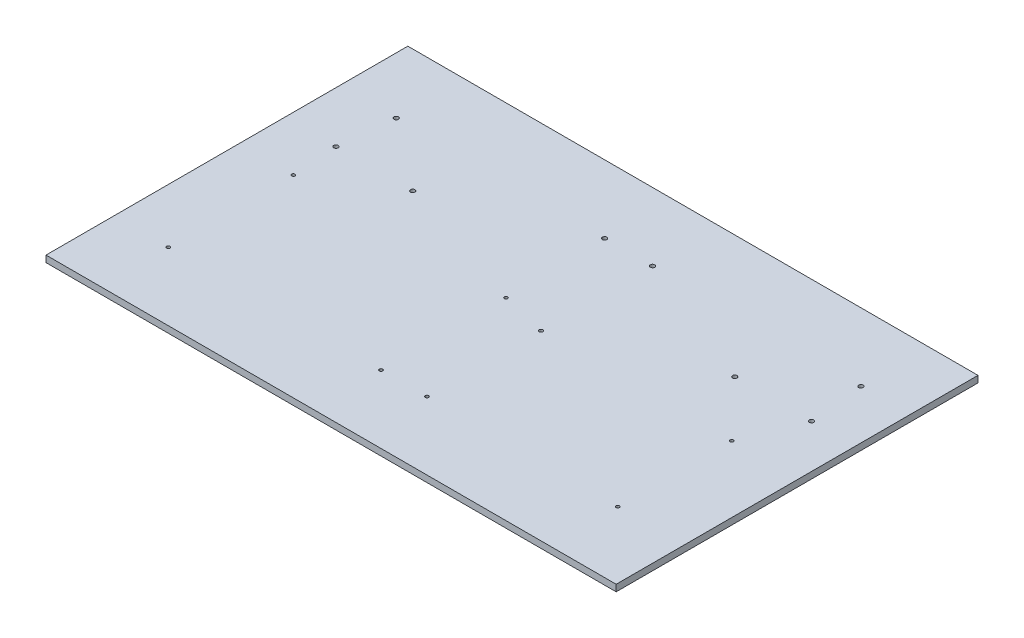
ISO-10303-21;
HEADER;
FILE_DESCRIPTION(('STEP AP214'),'2;1');
FILE_NAME('part.step','',(''),(''),'','','');
FILE_SCHEMA(('AUTOMOTIVE_DESIGN { 1 0 10303 214 1 1 1 1 }'));
ENDSEC;
DATA;
#1=APPLICATION_CONTEXT('core data for automotive mechanical design processes');
#2=APPLICATION_PROTOCOL_DEFINITION('international standard','automotive_design',2000,#1);
#3=PRODUCT_CONTEXT('',#1,'mechanical');
#4=PRODUCT('Part','Part','',(#3));
#5=PRODUCT_RELATED_PRODUCT_CATEGORY('part','',(#4));
#6=PRODUCT_DEFINITION_FORMATION('','',#4);
#7=PRODUCT_DEFINITION_CONTEXT('part definition',#1,'design');
#8=PRODUCT_DEFINITION('design','',#6,#7);
#9=PRODUCT_DEFINITION_SHAPE('','',#8);
#10=(LENGTH_UNIT() NAMED_UNIT(*) SI_UNIT(.MILLI.,.METRE.));
#11=(NAMED_UNIT(*) PLANE_ANGLE_UNIT() SI_UNIT($,.RADIAN.));
#12=(NAMED_UNIT(*) SI_UNIT($,.STERADIAN.) SOLID_ANGLE_UNIT());
#13=UNCERTAINTY_MEASURE_WITH_UNIT(LENGTH_MEASURE(1.E-05),#10,'distance_accuracy_value','');
#14=(GEOMETRIC_REPRESENTATION_CONTEXT(3) GLOBAL_UNCERTAINTY_ASSIGNED_CONTEXT((#13)) GLOBAL_UNIT_ASSIGNED_CONTEXT((#10,
#11,#12)) REPRESENTATION_CONTEXT('',''));
#15=CARTESIAN_POINT('',(0.,0.,0.));
#16=DIRECTION('',(0.,0.,1.));
#17=DIRECTION('',(1.,0.,0.));
#18=AXIS2_PLACEMENT_3D('',#15,#16,#17);
#19=CARTESIAN_POINT('',(0.,6.,0.));
#20=DIRECTION('',(1.,0.,0.));
#21=DIRECTION('',(0.,0.,-1.));
#22=AXIS2_PLACEMENT_3D('',#19,#20,#21);
#23=PLANE('',#22);
#24=DIRECTION('',(0.,0.,1.));
#25=VECTOR('',#24,1.);
#26=CARTESIAN_POINT('',(0.,0.,0.));
#27=LINE('',#26,#25);
#28=CARTESIAN_POINT('',(0.,0.,-330.));
#29=VERTEX_POINT('',#28);
#30=CARTESIAN_POINT('',(0.,0.,0.));
#31=VERTEX_POINT('',#30);
#32=EDGE_CURVE('E99',#29,#31,#27,.T.);
#33=ORIENTED_EDGE('',*,*,#32,.T.);
#34=DIRECTION('',(0.,-1.,0.));
#35=VECTOR('',#34,1.);
#36=CARTESIAN_POINT('',(0.,6.,0.));
#37=LINE('',#36,#35);
#38=CARTESIAN_POINT('',(0.,6.,0.));
#39=VERTEX_POINT('',#38);
#40=EDGE_CURVE('E11',#39,#31,#37,.T.);
#41=ORIENTED_EDGE('',*,*,#40,.F.);
#42=DIRECTION('',(0.,0.,1.));
#43=VECTOR('',#42,1.);
#44=CARTESIAN_POINT('',(0.,6.,0.));
#45=LINE('',#44,#43);
#46=CARTESIAN_POINT('',(0.,6.,-330.));
#47=VERTEX_POINT('',#46);
#48=EDGE_CURVE('E86',#47,#39,#45,.T.);
#49=ORIENTED_EDGE('',*,*,#48,.F.);
#50=DIRECTION('',(0.,-1.,0.));
#51=VECTOR('',#50,1.);
#52=CARTESIAN_POINT('',(0.,6.,-330.));
#53=LINE('',#52,#51);
#54=EDGE_CURVE('E95',#47,#29,#53,.T.);
#55=ORIENTED_EDGE('',*,*,#54,.T.);
#56=EDGE_LOOP('',(#33,#41,#49,#55));
#57=FACE_BOUND('',#56,.T.);
#58=ADVANCED_FACE('F33',(#57),#23,.F.);
#59=CARTESIAN_POINT('',(0.,6.,0.));
#60=DIRECTION('',(0.,0.,-1.));
#61=DIRECTION('',(-1.,0.,0.));
#62=AXIS2_PLACEMENT_3D('',#59,#60,#61);
#63=PLANE('',#62);
#64=DIRECTION('',(1.,0.,0.));
#65=VECTOR('',#64,1.);
#66=CARTESIAN_POINT('',(0.,0.,0.));
#67=LINE('',#66,#65);
#68=CARTESIAN_POINT('',(520.,0.,0.));
#69=VERTEX_POINT('',#68);
#70=EDGE_CURVE('E90',#31,#69,#67,.T.);
#71=ORIENTED_EDGE('',*,*,#70,.T.);
#72=DIRECTION('',(0.,-1.,0.));
#73=VECTOR('',#72,1.);
#74=CARTESIAN_POINT('',(520.,6.,0.));
#75=LINE('',#74,#73);
#76=CARTESIAN_POINT('',(520.,6.,0.));
#77=VERTEX_POINT('',#76);
#78=EDGE_CURVE('E42',#77,#69,#75,.T.);
#79=ORIENTED_EDGE('',*,*,#78,.F.);
#80=DIRECTION('',(1.,0.,0.));
#81=VECTOR('',#80,1.);
#82=CARTESIAN_POINT('',(0.,6.,0.));
#83=LINE('',#82,#81);
#84=EDGE_CURVE('E81',#39,#77,#83,.T.);
#85=ORIENTED_EDGE('',*,*,#84,.F.);
#86=ORIENTED_EDGE('',*,*,#40,.T.);
#87=EDGE_LOOP('',(#71,#79,#85,#86));
#88=FACE_BOUND('',#87,.T.);
#89=ADVANCED_FACE('F89',(#88),#63,.F.);
#90=CARTESIAN_POINT('',(520.,6.,0.));
#91=DIRECTION('',(-1.,0.,0.));
#92=DIRECTION('',(0.,0.,1.));
#93=AXIS2_PLACEMENT_3D('',#90,#91,#92);
#94=PLANE('',#93);
#95=DIRECTION('',(0.,0.,-1.));
#96=VECTOR('',#95,1.);
#97=CARTESIAN_POINT('',(520.,0.,0.));
#98=LINE('',#97,#96);
#99=CARTESIAN_POINT('',(520.,0.,-330.));
#100=VERTEX_POINT('',#99);
#101=EDGE_CURVE('E68',#69,#100,#98,.T.);
#102=ORIENTED_EDGE('',*,*,#101,.T.);
#103=DIRECTION('',(0.,-1.,0.));
#104=VECTOR('',#103,1.);
#105=CARTESIAN_POINT('',(520.,6.,-330.));
#106=LINE('',#105,#104);
#107=CARTESIAN_POINT('',(520.,6.,-330.));
#108=VERTEX_POINT('',#107);
#109=EDGE_CURVE('E91',#108,#100,#106,.T.);
#110=ORIENTED_EDGE('',*,*,#109,.F.);
#111=DIRECTION('',(0.,0.,-1.));
#112=VECTOR('',#111,1.);
#113=CARTESIAN_POINT('',(520.,6.,0.));
#114=LINE('',#113,#112);
#115=EDGE_CURVE('E84',#77,#108,#114,.T.);
#116=ORIENTED_EDGE('',*,*,#115,.F.);
#117=ORIENTED_EDGE('',*,*,#78,.T.);
#118=EDGE_LOOP('',(#102,#110,#116,#117));
#119=FACE_BOUND('',#118,.T.);
#120=ADVANCED_FACE('F93',(#119),#94,.F.);
#121=CARTESIAN_POINT('',(0.,6.,-330.));
#122=DIRECTION('',(0.,0.,1.));
#123=DIRECTION('',(1.,0.,0.));
#124=AXIS2_PLACEMENT_3D('',#121,#122,#123);
#125=PLANE('',#124);
#126=DIRECTION('',(-1.,0.,0.));
#127=VECTOR('',#126,1.);
#128=CARTESIAN_POINT('',(0.,0.,-330.));
#129=LINE('',#128,#127);
#130=EDGE_CURVE('E74',#100,#29,#129,.T.);
#131=ORIENTED_EDGE('',*,*,#130,.T.);
#132=ORIENTED_EDGE('',*,*,#54,.F.);
#133=DIRECTION('',(-1.,0.,0.));
#134=VECTOR('',#133,1.);
#135=CARTESIAN_POINT('',(0.,6.,-330.));
#136=LINE('',#135,#134);
#137=EDGE_CURVE('E51',#108,#47,#136,.T.);
#138=ORIENTED_EDGE('',*,*,#137,.F.);
#139=ORIENTED_EDGE('',*,*,#109,.T.);
#140=EDGE_LOOP('',(#131,#132,#138,#139));
#141=FACE_BOUND('',#140,.T.);
#142=ADVANCED_FACE('F212',(#141),#125,.F.);
#143=CARTESIAN_POINT('',(0.,6.,0.));
#144=DIRECTION('',(0.,-1.,0.));
#145=DIRECTION('',(0.,0.,-1.));
#146=AXIS2_PLACEMENT_3D('',#143,#144,#145);
#147=PLANE('',#146);
#148=CARTESIAN_POINT('',(480.232604686419,6.,-217.928656281398));
#149=DIRECTION('',(0.,1.,0.));
#150=DIRECTION('',(0.,0.,1.));
#151=AXIS2_PLACEMENT_3D('',#148,#149,#150);
#152=CIRCLE('',#151,2.);
#153=CARTESIAN_POINT('',(480.232604686419,6.,-215.928656281398));
#154=VERTEX_POINT('',#153);
#155=EDGE_CURVE('E115',#154,#154,#152,.T.);
#156=ORIENTED_EDGE('',*,*,#155,.F.);
#157=EDGE_LOOP('',(#156));
#158=FACE_BOUND('',#157,.T.);
#159=CARTESIAN_POINT('',(410.232604686419,6.,-217.928656281398));
#160=DIRECTION('',(0.,1.,0.));
#161=DIRECTION('',(0.,0.,1.));
#162=AXIS2_PLACEMENT_3D('',#159,#160,#161);
#163=CIRCLE('',#162,2.);
#164=CARTESIAN_POINT('',(410.232604686419,6.,-215.928656281398));
#165=VERTEX_POINT('',#164);
#166=EDGE_CURVE('E201',#165,#165,#163,.T.);
#167=ORIENTED_EDGE('',*,*,#166,.F.);
#168=EDGE_LOOP('',(#167));
#169=FACE_BOUND('',#168,.T.);
#170=CARTESIAN_POINT('',(285.232604686379,6.,-267.928656281466));
#171=DIRECTION('',(0.,1.,0.));
#172=DIRECTION('',(0.,0.,1.));
#173=AXIS2_PLACEMENT_3D('',#170,#171,#172);
#174=CIRCLE('',#173,2.);
#175=CARTESIAN_POINT('',(285.232604686379,6.,-265.928656281466));
#176=VERTEX_POINT('',#175);
#177=EDGE_CURVE('E198',#176,#176,#174,.T.);
#178=ORIENTED_EDGE('',*,*,#177,.F.);
#179=EDGE_LOOP('',(#178));
#180=FACE_BOUND('',#179,.T.);
#181=CARTESIAN_POINT('',(241.544745514711,6.,-267.928656281467));
#182=DIRECTION('',(0.,1.,0.));
#183=DIRECTION('',(0.,0.,1.));
#184=AXIS2_PLACEMENT_3D('',#181,#182,#183);
#185=CIRCLE('',#184,2.);
#186=CARTESIAN_POINT('',(241.544745514711,6.,-265.928656281467));
#187=VERTEX_POINT('',#186);
#188=EDGE_CURVE('E195',#187,#187,#185,.T.);
#189=ORIENTED_EDGE('',*,*,#188,.F.);
#190=EDGE_LOOP('',(#189));
#191=FACE_BOUND('',#190,.T.);
#192=CARTESIAN_POINT('',(51.5447455147113,6.,-267.928656281467));
#193=DIRECTION('',(0.,1.,0.));
#194=DIRECTION('',(0.,0.,1.));
#195=AXIS2_PLACEMENT_3D('',#192,#193,#194);
#196=CIRCLE('',#195,2.);
#197=CARTESIAN_POINT('',(51.5447455147113,6.,-265.928656281467));
#198=VERTEX_POINT('',#197);
#199=EDGE_CURVE('E192',#198,#198,#196,.T.);
#200=ORIENTED_EDGE('',*,*,#199,.F.);
#201=EDGE_LOOP('',(#200));
#202=FACE_BOUND('',#201,.T.);
#203=CARTESIAN_POINT('',(46.5447455148132,6.,-217.92865628121));
#204=DIRECTION('',(0.,1.,0.));
#205=DIRECTION('',(0.,0.,1.));
#206=AXIS2_PLACEMENT_3D('',#203,#204,#205);
#207=CIRCLE('',#206,2.);
#208=CARTESIAN_POINT('',(46.5447455148132,6.,-215.92865628121));
#209=VERTEX_POINT('',#208);
#210=EDGE_CURVE('E189',#209,#209,#207,.T.);
#211=ORIENTED_EDGE('',*,*,#210,.F.);
#212=EDGE_LOOP('',(#211));
#213=FACE_BOUND('',#212,.T.);
#214=CARTESIAN_POINT('',(116.544745514813,6.,-217.928656281211));
#215=DIRECTION('',(0.,1.,0.));
#216=DIRECTION('',(0.,0.,1.));
#217=AXIS2_PLACEMENT_3D('',#214,#215,#216);
#218=CIRCLE('',#217,2.);
#219=CARTESIAN_POINT('',(116.544745514813,6.,-215.928656281211));
#220=VERTEX_POINT('',#219);
#221=EDGE_CURVE('E186',#220,#220,#218,.T.);
#222=ORIENTED_EDGE('',*,*,#221,.F.);
#223=EDGE_LOOP('',(#222));
#224=FACE_BOUND('',#223,.T.);
#225=CARTESIAN_POINT('',(459.491291532149,6.,-165.959366851053));
#226=DIRECTION('',(0.,1.,0.));
#227=DIRECTION('',(0.,0.,1.));
#228=AXIS2_PLACEMENT_3D('',#225,#226,#227);
#229=CIRCLE('',#228,1.50000000000002);
#230=CARTESIAN_POINT('',(459.491291532149,6.,-164.459366851053));
#231=VERTEX_POINT('',#230);
#232=EDGE_CURVE('E183',#231,#231,#229,.T.);
#233=ORIENTED_EDGE('',*,*,#232,.F.);
#234=EDGE_LOOP('',(#233));
#235=FACE_BOUND('',#234,.T.);
#236=CARTESIAN_POINT('',(459.49129153215,6.,-61.9593668510529));
#237=DIRECTION('',(0.,1.,0.));
#238=DIRECTION('',(0.,0.,1.));
#239=AXIS2_PLACEMENT_3D('',#236,#237,#238);
#240=CIRCLE('',#239,1.50000000000002);
#241=CARTESIAN_POINT('',(459.49129153215,6.,-60.4593668510528));
#242=VERTEX_POINT('',#241);
#243=EDGE_CURVE('E180',#242,#242,#240,.T.);
#244=ORIENTED_EDGE('',*,*,#243,.F.);
#245=EDGE_LOOP('',(#244));
#246=FACE_BOUND('',#245,.T.);
#247=CARTESIAN_POINT('',(285.49129153215,6.,-61.9593668510523));
#248=DIRECTION('',(0.,1.,0.));
#249=DIRECTION('',(0.,0.,1.));
#250=AXIS2_PLACEMENT_3D('',#247,#248,#249);
#251=CIRCLE('',#250,1.49999999999996);
#252=CARTESIAN_POINT('',(285.49129153215,6.,-60.4593668510523));
#253=VERTEX_POINT('',#252);
#254=EDGE_CURVE('E177',#253,#253,#251,.T.);
#255=ORIENTED_EDGE('',*,*,#254,.F.);
#256=EDGE_LOOP('',(#255));
#257=FACE_BOUND('',#256,.T.);
#258=CARTESIAN_POINT('',(285.491291532149,6.,-165.959366851052));
#259=DIRECTION('',(0.,1.,0.));
#260=DIRECTION('',(0.,0.,1.));
#261=AXIS2_PLACEMENT_3D('',#258,#259,#260);
#262=CIRCLE('',#261,1.65933026561281);
#263=CARTESIAN_POINT('',(285.491291532149,6.,-164.300036585439));
#264=VERTEX_POINT('',#263);
#265=EDGE_CURVE('E174',#264,#264,#262,.T.);
#266=ORIENTED_EDGE('',*,*,#265,.F.);
#267=EDGE_LOOP('',(#266));
#268=FACE_BOUND('',#267,.T.);
#269=CARTESIAN_POINT('',(243.563945180273,6.,-175.959366851052));
#270=DIRECTION('',(0.,1.,0.));
#271=DIRECTION('',(0.,0.,1.));
#272=AXIS2_PLACEMENT_3D('',#269,#270,#271);
#273=CIRCLE('',#272,1.5);
#274=CARTESIAN_POINT('',(243.563945180273,6.,-174.459366851052));
#275=VERTEX_POINT('',#274);
#276=EDGE_CURVE('E171',#275,#275,#273,.T.);
#277=ORIENTED_EDGE('',*,*,#276,.F.);
#278=EDGE_LOOP('',(#277));
#279=FACE_BOUND('',#278,.T.);
#280=CARTESIAN_POINT('',(243.563945180273,6.,-61.9593668510524));
#281=DIRECTION('',(0.,1.,0.));
#282=DIRECTION('',(0.,0.,1.));
#283=AXIS2_PLACEMENT_3D('',#280,#281,#282);
#284=CIRCLE('',#283,1.5);
#285=CARTESIAN_POINT('',(243.563945180273,6.,-60.4593668510524));
#286=VERTEX_POINT('',#285);
#287=EDGE_CURVE('E168',#286,#286,#284,.T.);
#288=ORIENTED_EDGE('',*,*,#287,.F.);
#289=EDGE_LOOP('',(#288));
#290=FACE_BOUND('',#289,.T.);
#291=CARTESIAN_POINT('',(49.5639451802729,6.,-61.9593668510524));
#292=DIRECTION('',(0.,1.,0.));
#293=DIRECTION('',(0.,0.,1.));
#294=AXIS2_PLACEMENT_3D('',#291,#292,#293);
#295=CIRCLE('',#294,1.5);
#296=CARTESIAN_POINT('',(49.5639451802729,6.,-60.4593668510524));
#297=VERTEX_POINT('',#296);
#298=EDGE_CURVE('E165',#297,#297,#295,.T.);
#299=ORIENTED_EDGE('',*,*,#298,.F.);
#300=EDGE_LOOP('',(#299));
#301=FACE_BOUND('',#300,.T.);
#302=CARTESIAN_POINT('',(49.5639451802729,6.,-175.959366851052));
#303=DIRECTION('',(0.,1.,0.));
#304=DIRECTION('',(0.,0.,1.));
#305=AXIS2_PLACEMENT_3D('',#302,#303,#304);
#306=CIRCLE('',#305,1.5);
#307=CARTESIAN_POINT('',(49.5639451802729,6.,-174.459366851052));
#308=VERTEX_POINT('',#307);
#309=EDGE_CURVE('E162',#308,#308,#306,.T.);
#310=ORIENTED_EDGE('',*,*,#309,.F.);
#311=EDGE_LOOP('',(#310));
#312=FACE_BOUND('',#311,.T.);
#313=CARTESIAN_POINT('',(475.232604686379,6.,-267.928656281466));
#314=DIRECTION('',(0.,1.,0.));
#315=DIRECTION('',(0.,0.,1.));
#316=AXIS2_PLACEMENT_3D('',#313,#314,#315);
#317=CIRCLE('',#316,2.);
#318=CARTESIAN_POINT('',(475.232604686379,6.,-265.928656281466));
#319=VERTEX_POINT('',#318);
#320=EDGE_CURVE('E110',#319,#319,#317,.T.);
#321=ORIENTED_EDGE('',*,*,#320,.F.);
#322=EDGE_LOOP('',(#321));
#323=FACE_BOUND('',#322,.T.);
#324=ORIENTED_EDGE('',*,*,#48,.T.);
#325=ORIENTED_EDGE('',*,*,#84,.T.);
#326=ORIENTED_EDGE('',*,*,#115,.T.);
#327=ORIENTED_EDGE('',*,*,#137,.T.);
#328=EDGE_LOOP('',(#324,#325,#326,#327));
#329=FACE_BOUND('',#328,.T.);
#330=ADVANCED_FACE('F82',(#158,#169,#180,#191,#202,#213,#224,#235,#246,#257,#268,#279,#290,#301,
#312,#323,#329),#147,.F.);
#331=CARTESIAN_POINT('',(0.,0.,0.));
#332=DIRECTION('',(0.,-1.,0.));
#333=DIRECTION('',(0.,0.,-1.));
#334=AXIS2_PLACEMENT_3D('',#331,#332,#333);
#335=PLANE('',#334);
#336=CARTESIAN_POINT('',(480.232604686419,0.,-217.928656281398));
#337=DIRECTION('',(0.,-1.,0.));
#338=DIRECTION('',(0.,0.,-1.));
#339=AXIS2_PLACEMENT_3D('',#336,#337,#338);
#340=CIRCLE('',#339,2.);
#341=CARTESIAN_POINT('',(480.232604686419,0.,-219.928656281398));
#342=VERTEX_POINT('',#341);
#343=EDGE_CURVE('E36',#342,#342,#340,.T.);
#344=ORIENTED_EDGE('',*,*,#343,.F.);
#345=EDGE_LOOP('',(#344));
#346=FACE_BOUND('',#345,.T.);
#347=CARTESIAN_POINT('',(410.232604686419,0.,-217.928656281398));
#348=DIRECTION('',(0.,-1.,0.));
#349=DIRECTION('',(0.,0.,-1.));
#350=AXIS2_PLACEMENT_3D('',#347,#348,#349);
#351=CIRCLE('',#350,2.);
#352=CARTESIAN_POINT('',(410.232604686419,0.,-219.928656281398));
#353=VERTEX_POINT('',#352);
#354=EDGE_CURVE('E150',#353,#353,#351,.T.);
#355=ORIENTED_EDGE('',*,*,#354,.F.);
#356=EDGE_LOOP('',(#355));
#357=FACE_BOUND('',#356,.T.);
#358=CARTESIAN_POINT('',(285.232604686379,0.,-267.928656281466));
#359=DIRECTION('',(0.,-1.,0.));
#360=DIRECTION('',(0.,0.,-1.));
#361=AXIS2_PLACEMENT_3D('',#358,#359,#360);
#362=CIRCLE('',#361,2.);
#363=CARTESIAN_POINT('',(285.232604686379,0.,-269.928656281466));
#364=VERTEX_POINT('',#363);
#365=EDGE_CURVE('E148',#364,#364,#362,.T.);
#366=ORIENTED_EDGE('',*,*,#365,.F.);
#367=EDGE_LOOP('',(#366));
#368=FACE_BOUND('',#367,.T.);
#369=CARTESIAN_POINT('',(241.544745514711,0.,-267.928656281467));
#370=DIRECTION('',(0.,-1.,0.));
#371=DIRECTION('',(0.,0.,-1.));
#372=AXIS2_PLACEMENT_3D('',#369,#370,#371);
#373=CIRCLE('',#372,2.);
#374=CARTESIAN_POINT('',(241.544745514711,0.,-269.928656281467));
#375=VERTEX_POINT('',#374);
#376=EDGE_CURVE('E145',#375,#375,#373,.T.);
#377=ORIENTED_EDGE('',*,*,#376,.F.);
#378=EDGE_LOOP('',(#377));
#379=FACE_BOUND('',#378,.T.);
#380=CARTESIAN_POINT('',(51.5447455147113,0.,-267.928656281467));
#381=DIRECTION('',(0.,-1.,0.));
#382=DIRECTION('',(0.,0.,-1.));
#383=AXIS2_PLACEMENT_3D('',#380,#381,#382);
#384=CIRCLE('',#383,2.);
#385=CARTESIAN_POINT('',(51.5447455147113,0.,-269.928656281467));
#386=VERTEX_POINT('',#385);
#387=EDGE_CURVE('E142',#386,#386,#384,.T.);
#388=ORIENTED_EDGE('',*,*,#387,.F.);
#389=EDGE_LOOP('',(#388));
#390=FACE_BOUND('',#389,.T.);
#391=CARTESIAN_POINT('',(46.5447455148132,0.,-217.92865628121));
#392=DIRECTION('',(0.,-1.,0.));
#393=DIRECTION('',(0.,0.,-1.));
#394=AXIS2_PLACEMENT_3D('',#391,#392,#393);
#395=CIRCLE('',#394,2.);
#396=CARTESIAN_POINT('',(46.5447455148132,0.,-219.92865628121));
#397=VERTEX_POINT('',#396);
#398=EDGE_CURVE('E139',#397,#397,#395,.T.);
#399=ORIENTED_EDGE('',*,*,#398,.F.);
#400=EDGE_LOOP('',(#399));
#401=FACE_BOUND('',#400,.T.);
#402=CARTESIAN_POINT('',(116.544745514813,0.,-217.928656281211));
#403=DIRECTION('',(0.,-1.,0.));
#404=DIRECTION('',(0.,0.,-1.));
#405=AXIS2_PLACEMENT_3D('',#402,#403,#404);
#406=CIRCLE('',#405,2.);
#407=CARTESIAN_POINT('',(116.544745514813,0.,-219.928656281211));
#408=VERTEX_POINT('',#407);
#409=EDGE_CURVE('E136',#408,#408,#406,.T.);
#410=ORIENTED_EDGE('',*,*,#409,.F.);
#411=EDGE_LOOP('',(#410));
#412=FACE_BOUND('',#411,.T.);
#413=CARTESIAN_POINT('',(459.491291532149,0.,-165.959366851053));
#414=DIRECTION('',(0.,-1.,0.));
#415=DIRECTION('',(0.,0.,-1.));
#416=AXIS2_PLACEMENT_3D('',#413,#414,#415);
#417=CIRCLE('',#416,1.50000000000002);
#418=CARTESIAN_POINT('',(459.491291532149,0.,-167.459366851053));
#419=VERTEX_POINT('',#418);
#420=EDGE_CURVE('E133',#419,#419,#417,.T.);
#421=ORIENTED_EDGE('',*,*,#420,.F.);
#422=EDGE_LOOP('',(#421));
#423=FACE_BOUND('',#422,.T.);
#424=CARTESIAN_POINT('',(459.49129153215,0.,-61.9593668510529));
#425=DIRECTION('',(0.,-1.,0.));
#426=DIRECTION('',(0.,0.,-1.));
#427=AXIS2_PLACEMENT_3D('',#424,#425,#426);
#428=CIRCLE('',#427,1.50000000000002);
#429=CARTESIAN_POINT('',(459.49129153215,0.,-63.4593668510529));
#430=VERTEX_POINT('',#429);
#431=EDGE_CURVE('E130',#430,#430,#428,.T.);
#432=ORIENTED_EDGE('',*,*,#431,.F.);
#433=EDGE_LOOP('',(#432));
#434=FACE_BOUND('',#433,.T.);
#435=CARTESIAN_POINT('',(285.49129153215,0.,-61.9593668510523));
#436=DIRECTION('',(0.,-1.,0.));
#437=DIRECTION('',(0.,0.,-1.));
#438=AXIS2_PLACEMENT_3D('',#435,#436,#437);
#439=CIRCLE('',#438,1.49999999999996);
#440=CARTESIAN_POINT('',(285.49129153215,0.,-63.4593668510522));
#441=VERTEX_POINT('',#440);
#442=EDGE_CURVE('E127',#441,#441,#439,.T.);
#443=ORIENTED_EDGE('',*,*,#442,.F.);
#444=EDGE_LOOP('',(#443));
#445=FACE_BOUND('',#444,.T.);
#446=CARTESIAN_POINT('',(285.491291532149,0.,-165.959366851052));
#447=DIRECTION('',(0.,-1.,0.));
#448=DIRECTION('',(0.,0.,-1.));
#449=AXIS2_PLACEMENT_3D('',#446,#447,#448);
#450=CIRCLE('',#449,1.65933026561281);
#451=CARTESIAN_POINT('',(285.491291532149,0.,-167.618697116665));
#452=VERTEX_POINT('',#451);
#453=EDGE_CURVE('E124',#452,#452,#450,.T.);
#454=ORIENTED_EDGE('',*,*,#453,.F.);
#455=EDGE_LOOP('',(#454));
#456=FACE_BOUND('',#455,.T.);
#457=CARTESIAN_POINT('',(243.563945180273,0.,-175.959366851052));
#458=DIRECTION('',(0.,-1.,0.));
#459=DIRECTION('',(0.,0.,-1.));
#460=AXIS2_PLACEMENT_3D('',#457,#458,#459);
#461=CIRCLE('',#460,1.5);
#462=CARTESIAN_POINT('',(243.563945180273,0.,-177.459366851052));
#463=VERTEX_POINT('',#462);
#464=EDGE_CURVE('E121',#463,#463,#461,.T.);
#465=ORIENTED_EDGE('',*,*,#464,.F.);
#466=EDGE_LOOP('',(#465));
#467=FACE_BOUND('',#466,.T.);
#468=CARTESIAN_POINT('',(243.563945180273,0.,-61.9593668510524));
#469=DIRECTION('',(0.,-1.,0.));
#470=DIRECTION('',(0.,0.,-1.));
#471=AXIS2_PLACEMENT_3D('',#468,#469,#470);
#472=CIRCLE('',#471,1.5);
#473=CARTESIAN_POINT('',(243.563945180273,0.,-63.4593668510524));
#474=VERTEX_POINT('',#473);
#475=EDGE_CURVE('E118',#474,#474,#472,.T.);
#476=ORIENTED_EDGE('',*,*,#475,.F.);
#477=EDGE_LOOP('',(#476));
#478=FACE_BOUND('',#477,.T.);
#479=CARTESIAN_POINT('',(49.5639451802729,0.,-61.9593668510524));
#480=DIRECTION('',(0.,-1.,0.));
#481=DIRECTION('',(0.,0.,-1.));
#482=AXIS2_PLACEMENT_3D('',#479,#480,#481);
#483=CIRCLE('',#482,1.5);
#484=CARTESIAN_POINT('',(49.5639451802729,0.,-63.4593668510524));
#485=VERTEX_POINT('',#484);
#486=EDGE_CURVE('E114',#485,#485,#483,.T.);
#487=ORIENTED_EDGE('',*,*,#486,.F.);
#488=EDGE_LOOP('',(#487));
#489=FACE_BOUND('',#488,.T.);
#490=CARTESIAN_POINT('',(49.5639451802729,0.,-175.959366851052));
#491=DIRECTION('',(0.,-1.,0.));
#492=DIRECTION('',(0.,0.,-1.));
#493=AXIS2_PLACEMENT_3D('',#490,#491,#492);
#494=CIRCLE('',#493,1.5);
#495=CARTESIAN_POINT('',(49.5639451802729,0.,-177.459366851052));
#496=VERTEX_POINT('',#495);
#497=EDGE_CURVE('E111',#496,#496,#494,.T.);
#498=ORIENTED_EDGE('',*,*,#497,.F.);
#499=EDGE_LOOP('',(#498));
#500=FACE_BOUND('',#499,.T.);
#501=CARTESIAN_POINT('',(475.232604686379,0.,-267.928656281466));
#502=DIRECTION('',(0.,-1.,0.));
#503=DIRECTION('',(0.,0.,-1.));
#504=AXIS2_PLACEMENT_3D('',#501,#502,#503);
#505=CIRCLE('',#504,2.);
#506=CARTESIAN_POINT('',(475.232604686379,0.,-269.928656281466));
#507=VERTEX_POINT('',#506);
#508=EDGE_CURVE('E102',#507,#507,#505,.T.);
#509=ORIENTED_EDGE('',*,*,#508,.F.);
#510=EDGE_LOOP('',(#509));
#511=FACE_BOUND('',#510,.T.);
#512=ORIENTED_EDGE('',*,*,#32,.F.);
#513=ORIENTED_EDGE('',*,*,#130,.F.);
#514=ORIENTED_EDGE('',*,*,#101,.F.);
#515=ORIENTED_EDGE('',*,*,#70,.F.);
#516=EDGE_LOOP('',(#512,#513,#514,#515));
#517=FACE_BOUND('',#516,.T.);
#518=ADVANCED_FACE('F211',(#346,#357,#368,#379,#390,#401,#412,#423,#434,#445,#456,#467,#478,
#489,#500,#511,#517),#335,.T.);
#519=CARTESIAN_POINT('',(475.232604686379,-4.,-267.928656281466));
#520=DIRECTION('',(0.,1.,0.));
#521=DIRECTION('',(0.,0.,1.));
#522=AXIS2_PLACEMENT_3D('',#519,#520,#521);
#523=CYLINDRICAL_SURFACE('',#522,2.);
#524=ORIENTED_EDGE('',*,*,#508,.T.);
#525=EDGE_LOOP('',(#524));
#526=FACE_BOUND('',#525,.T.);
#527=ORIENTED_EDGE('',*,*,#320,.T.);
#528=EDGE_LOOP('',(#527));
#529=FACE_BOUND('',#528,.T.);
#530=ADVANCED_FACE('F246',(#526,#529),#523,.F.);
#531=CARTESIAN_POINT('',(49.5639451802729,-4.,-175.959366851052));
#532=DIRECTION('',(0.,1.,0.));
#533=DIRECTION('',(0.,0.,1.));
#534=AXIS2_PLACEMENT_3D('',#531,#532,#533);
#535=CYLINDRICAL_SURFACE('',#534,1.5);
#536=ORIENTED_EDGE('',*,*,#497,.T.);
#537=EDGE_LOOP('',(#536));
#538=FACE_BOUND('',#537,.T.);
#539=ORIENTED_EDGE('',*,*,#309,.T.);
#540=EDGE_LOOP('',(#539));
#541=FACE_BOUND('',#540,.T.);
#542=ADVANCED_FACE('F243',(#538,#541),#535,.F.);
#543=CARTESIAN_POINT('',(49.5639451802729,-4.,-61.9593668510524));
#544=DIRECTION('',(0.,1.,0.));
#545=DIRECTION('',(0.,0.,1.));
#546=AXIS2_PLACEMENT_3D('',#543,#544,#545);
#547=CYLINDRICAL_SURFACE('',#546,1.5);
#548=ORIENTED_EDGE('',*,*,#486,.T.);
#549=EDGE_LOOP('',(#548));
#550=FACE_BOUND('',#549,.T.);
#551=ORIENTED_EDGE('',*,*,#298,.T.);
#552=EDGE_LOOP('',(#551));
#553=FACE_BOUND('',#552,.T.);
#554=ADVANCED_FACE('F245',(#550,#553),#547,.F.);
#555=CARTESIAN_POINT('',(243.563945180273,-4.,-61.9593668510524));
#556=DIRECTION('',(0.,1.,0.));
#557=DIRECTION('',(0.,0.,1.));
#558=AXIS2_PLACEMENT_3D('',#555,#556,#557);
#559=CYLINDRICAL_SURFACE('',#558,1.5);
#560=ORIENTED_EDGE('',*,*,#475,.T.);
#561=EDGE_LOOP('',(#560));
#562=FACE_BOUND('',#561,.T.);
#563=ORIENTED_EDGE('',*,*,#287,.T.);
#564=EDGE_LOOP('',(#563));
#565=FACE_BOUND('',#564,.T.);
#566=ADVANCED_FACE('F253',(#562,#565),#559,.F.);
#567=CARTESIAN_POINT('',(243.563945180273,-4.,-175.959366851052));
#568=DIRECTION('',(0.,1.,0.));
#569=DIRECTION('',(0.,0.,1.));
#570=AXIS2_PLACEMENT_3D('',#567,#568,#569);
#571=CYLINDRICAL_SURFACE('',#570,1.5);
#572=ORIENTED_EDGE('',*,*,#464,.T.);
#573=EDGE_LOOP('',(#572));
#574=FACE_BOUND('',#573,.T.);
#575=ORIENTED_EDGE('',*,*,#276,.T.);
#576=EDGE_LOOP('',(#575));
#577=FACE_BOUND('',#576,.T.);
#578=ADVANCED_FACE('F316',(#574,#577),#571,.F.);
#579=CARTESIAN_POINT('',(285.491291532149,-4.,-165.959366851052));
#580=DIRECTION('',(0.,1.,0.));
#581=DIRECTION('',(0.,0.,1.));
#582=AXIS2_PLACEMENT_3D('',#579,#580,#581);
#583=CYLINDRICAL_SURFACE('',#582,1.65933026561281);
#584=ORIENTED_EDGE('',*,*,#453,.T.);
#585=EDGE_LOOP('',(#584));
#586=FACE_BOUND('',#585,.T.);
#587=ORIENTED_EDGE('',*,*,#265,.T.);
#588=EDGE_LOOP('',(#587));
#589=FACE_BOUND('',#588,.T.);
#590=ADVANCED_FACE('F326',(#586,#589),#583,.F.);
#591=CARTESIAN_POINT('',(285.49129153215,-4.,-61.9593668510523));
#592=DIRECTION('',(0.,1.,0.));
#593=DIRECTION('',(0.,0.,1.));
#594=AXIS2_PLACEMENT_3D('',#591,#592,#593);
#595=CYLINDRICAL_SURFACE('',#594,1.49999999999996);
#596=ORIENTED_EDGE('',*,*,#442,.T.);
#597=EDGE_LOOP('',(#596));
#598=FACE_BOUND('',#597,.T.);
#599=ORIENTED_EDGE('',*,*,#254,.T.);
#600=EDGE_LOOP('',(#599));
#601=FACE_BOUND('',#600,.T.);
#602=ADVANCED_FACE('F336',(#598,#601),#595,.F.);
#603=CARTESIAN_POINT('',(459.49129153215,-4.,-61.9593668510529));
#604=DIRECTION('',(0.,1.,0.));
#605=DIRECTION('',(0.,0.,1.));
#606=AXIS2_PLACEMENT_3D('',#603,#604,#605);
#607=CYLINDRICAL_SURFACE('',#606,1.50000000000002);
#608=ORIENTED_EDGE('',*,*,#431,.T.);
#609=EDGE_LOOP('',(#608));
#610=FACE_BOUND('',#609,.T.);
#611=ORIENTED_EDGE('',*,*,#243,.T.);
#612=EDGE_LOOP('',(#611));
#613=FACE_BOUND('',#612,.T.);
#614=ADVANCED_FACE('F346',(#610,#613),#607,.F.);
#615=CARTESIAN_POINT('',(459.491291532149,-4.,-165.959366851053));
#616=DIRECTION('',(0.,1.,0.));
#617=DIRECTION('',(0.,0.,1.));
#618=AXIS2_PLACEMENT_3D('',#615,#616,#617);
#619=CYLINDRICAL_SURFACE('',#618,1.50000000000002);
#620=ORIENTED_EDGE('',*,*,#420,.T.);
#621=EDGE_LOOP('',(#620));
#622=FACE_BOUND('',#621,.T.);
#623=ORIENTED_EDGE('',*,*,#232,.T.);
#624=EDGE_LOOP('',(#623));
#625=FACE_BOUND('',#624,.T.);
#626=ADVANCED_FACE('F356',(#622,#625),#619,.F.);
#627=CARTESIAN_POINT('',(116.544745514813,-4.,-217.928656281211));
#628=DIRECTION('',(0.,1.,0.));
#629=DIRECTION('',(0.,0.,1.));
#630=AXIS2_PLACEMENT_3D('',#627,#628,#629);
#631=CYLINDRICAL_SURFACE('',#630,2.);
#632=ORIENTED_EDGE('',*,*,#409,.T.);
#633=EDGE_LOOP('',(#632));
#634=FACE_BOUND('',#633,.T.);
#635=ORIENTED_EDGE('',*,*,#221,.T.);
#636=EDGE_LOOP('',(#635));
#637=FACE_BOUND('',#636,.T.);
#638=ADVANCED_FACE('F366',(#634,#637),#631,.F.);
#639=CARTESIAN_POINT('',(46.5447455148132,-4.,-217.92865628121));
#640=DIRECTION('',(0.,1.,0.));
#641=DIRECTION('',(0.,0.,1.));
#642=AXIS2_PLACEMENT_3D('',#639,#640,#641);
#643=CYLINDRICAL_SURFACE('',#642,2.);
#644=ORIENTED_EDGE('',*,*,#398,.T.);
#645=EDGE_LOOP('',(#644));
#646=FACE_BOUND('',#645,.T.);
#647=ORIENTED_EDGE('',*,*,#210,.T.);
#648=EDGE_LOOP('',(#647));
#649=FACE_BOUND('',#648,.T.);
#650=ADVANCED_FACE('F376',(#646,#649),#643,.F.);
#651=CARTESIAN_POINT('',(51.5447455147113,-4.,-267.928656281467));
#652=DIRECTION('',(0.,1.,0.));
#653=DIRECTION('',(0.,0.,1.));
#654=AXIS2_PLACEMENT_3D('',#651,#652,#653);
#655=CYLINDRICAL_SURFACE('',#654,2.);
#656=ORIENTED_EDGE('',*,*,#387,.T.);
#657=EDGE_LOOP('',(#656));
#658=FACE_BOUND('',#657,.T.);
#659=ORIENTED_EDGE('',*,*,#199,.T.);
#660=EDGE_LOOP('',(#659));
#661=FACE_BOUND('',#660,.T.);
#662=ADVANCED_FACE('F386',(#658,#661),#655,.F.);
#663=CARTESIAN_POINT('',(241.544745514711,-4.,-267.928656281467));
#664=DIRECTION('',(0.,1.,0.));
#665=DIRECTION('',(0.,0.,1.));
#666=AXIS2_PLACEMENT_3D('',#663,#664,#665);
#667=CYLINDRICAL_SURFACE('',#666,2.);
#668=ORIENTED_EDGE('',*,*,#376,.T.);
#669=EDGE_LOOP('',(#668));
#670=FACE_BOUND('',#669,.T.);
#671=ORIENTED_EDGE('',*,*,#188,.T.);
#672=EDGE_LOOP('',(#671));
#673=FACE_BOUND('',#672,.T.);
#674=ADVANCED_FACE('F396',(#670,#673),#667,.F.);
#675=CARTESIAN_POINT('',(285.232604686379,-4.,-267.928656281466));
#676=DIRECTION('',(0.,1.,0.));
#677=DIRECTION('',(0.,0.,1.));
#678=AXIS2_PLACEMENT_3D('',#675,#676,#677);
#679=CYLINDRICAL_SURFACE('',#678,2.);
#680=ORIENTED_EDGE('',*,*,#365,.T.);
#681=EDGE_LOOP('',(#680));
#682=FACE_BOUND('',#681,.T.);
#683=ORIENTED_EDGE('',*,*,#177,.T.);
#684=EDGE_LOOP('',(#683));
#685=FACE_BOUND('',#684,.T.);
#686=ADVANCED_FACE('F406',(#682,#685),#679,.F.);
#687=CARTESIAN_POINT('',(410.232604686419,-4.,-217.928656281398));
#688=DIRECTION('',(0.,1.,0.));
#689=DIRECTION('',(0.,0.,1.));
#690=AXIS2_PLACEMENT_3D('',#687,#688,#689);
#691=CYLINDRICAL_SURFACE('',#690,2.);
#692=ORIENTED_EDGE('',*,*,#354,.T.);
#693=EDGE_LOOP('',(#692));
#694=FACE_BOUND('',#693,.T.);
#695=ORIENTED_EDGE('',*,*,#166,.T.);
#696=EDGE_LOOP('',(#695));
#697=FACE_BOUND('',#696,.T.);
#698=ADVANCED_FACE('F416',(#694,#697),#691,.F.);
#699=CARTESIAN_POINT('',(480.232604686419,-4.,-217.928656281398));
#700=DIRECTION('',(0.,1.,0.));
#701=DIRECTION('',(0.,0.,1.));
#702=AXIS2_PLACEMENT_3D('',#699,#700,#701);
#703=CYLINDRICAL_SURFACE('',#702,2.);
#704=ORIENTED_EDGE('',*,*,#343,.T.);
#705=EDGE_LOOP('',(#704));
#706=FACE_BOUND('',#705,.T.);
#707=ORIENTED_EDGE('',*,*,#155,.T.);
#708=EDGE_LOOP('',(#707));
#709=FACE_BOUND('',#708,.T.);
#710=ADVANCED_FACE('F207',(#706,#709),#703,.F.);
#711=CLOSED_SHELL('',(#58,#89,#120,#142,#330,#518,#530,#542,#554,#566,#578,#590,#602,#614,#626,
#638,#650,#662,#674,#686,#698,#710));
#712=MANIFOLD_SOLID_BREP('B2',#711);
#713=ADVANCED_BREP_SHAPE_REPRESENTATION('',(#18,#712),#14);
#714=SHAPE_DEFINITION_REPRESENTATION(#9,#713);
ENDSEC;
END-ISO-10303-21;
